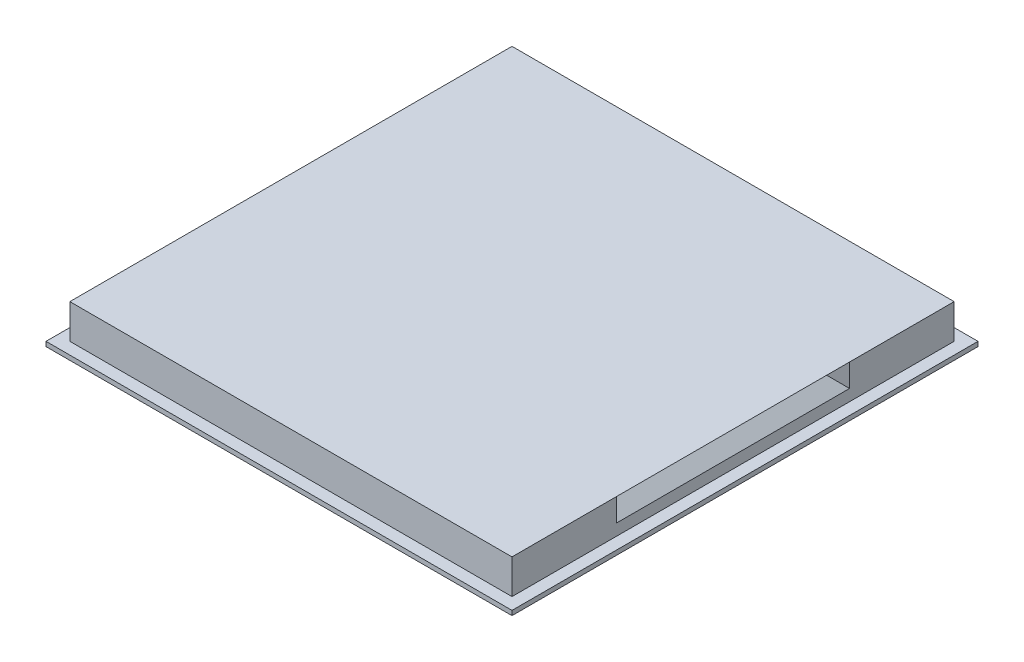
ISO-10303-21;
HEADER;
FILE_DESCRIPTION(('STEP AP214'),'2;1');
FILE_NAME('part.step','',(''),(''),'','','');
FILE_SCHEMA(('AUTOMOTIVE_DESIGN { 1 0 10303 214 1 1 1 1 }'));
ENDSEC;
DATA;
#1=APPLICATION_CONTEXT('core data for automotive mechanical design processes');
#2=APPLICATION_PROTOCOL_DEFINITION('international standard','automotive_design',2000,#1);
#3=PRODUCT_CONTEXT('',#1,'mechanical');
#4=PRODUCT('Part','Part','',(#3));
#5=PRODUCT_RELATED_PRODUCT_CATEGORY('part','',(#4));
#6=PRODUCT_DEFINITION_FORMATION('','',#4);
#7=PRODUCT_DEFINITION_CONTEXT('part definition',#1,'design');
#8=PRODUCT_DEFINITION('design','',#6,#7);
#9=PRODUCT_DEFINITION_SHAPE('','',#8);
#10=(LENGTH_UNIT() NAMED_UNIT(*) SI_UNIT(.MILLI.,.METRE.));
#11=(NAMED_UNIT(*) PLANE_ANGLE_UNIT() SI_UNIT($,.RADIAN.));
#12=(NAMED_UNIT(*) SI_UNIT($,.STERADIAN.) SOLID_ANGLE_UNIT());
#13=UNCERTAINTY_MEASURE_WITH_UNIT(LENGTH_MEASURE(1.E-05),#10,'distance_accuracy_value','');
#14=(GEOMETRIC_REPRESENTATION_CONTEXT(3) GLOBAL_UNCERTAINTY_ASSIGNED_CONTEXT((#13)) GLOBAL_UNIT_ASSIGNED_CONTEXT((#10,
#11,#12)) REPRESENTATION_CONTEXT('',''));
#15=CARTESIAN_POINT('',(0.,0.,0.));
#16=DIRECTION('',(0.,0.,1.));
#17=DIRECTION('',(1.,0.,0.));
#18=AXIS2_PLACEMENT_3D('',#15,#16,#17);
#19=CARTESIAN_POINT('',(88.9061151079137,17.,-53.0476618705036));
#20=DIRECTION('',(-1.,0.,0.));
#21=DIRECTION('',(0.,0.,1.));
#22=AXIS2_PLACEMENT_3D('',#19,#20,#21);
#23=PLANE('',#22);
#24=DIRECTION('',(0.,-1.,0.));
#25=VECTOR('',#24,1.);
#26=CARTESIAN_POINT('',(88.9061151079137,17.,-7.44766187050363));
#27=LINE('',#26,#25);
#28=CARTESIAN_POINT('',(88.9061151079137,17.,-7.44766187050363));
#29=VERTEX_POINT('',#28);
#30=CARTESIAN_POINT('',(88.9061151079137,6.99999999999995,-7.44766187050363));
#31=VERTEX_POINT('',#30);
#32=EDGE_CURVE('E58',#29,#31,#27,.T.);
#33=ORIENTED_EDGE('',*,*,#32,.T.);
#34=DIRECTION('',(0.,0.,1.));
#35=VECTOR('',#34,1.);
#36=CARTESIAN_POINT('',(88.9061151079137,6.99999999999995,-7.44766187050363));
#37=LINE('',#36,#35);
#38=CARTESIAN_POINT('',(88.9061151079137,6.99999999999999,94.1523381294964));
#39=VERTEX_POINT('',#38);
#40=EDGE_CURVE('E169',#31,#39,#37,.T.);
#41=ORIENTED_EDGE('',*,*,#40,.T.);
#42=DIRECTION('',(0.,1.,0.));
#43=VECTOR('',#42,1.);
#44=CARTESIAN_POINT('',(88.9061151079137,17.,94.1523381294964));
#45=LINE('',#44,#43);
#46=CARTESIAN_POINT('',(88.9061151079137,17.,94.1523381294964));
#47=VERTEX_POINT('',#46);
#48=EDGE_CURVE('E152',#39,#47,#45,.T.);
#49=ORIENTED_EDGE('',*,*,#48,.T.);
#50=DIRECTION('',(0.,0.,-1.));
#51=VECTOR('',#50,1.);
#52=CARTESIAN_POINT('',(88.9061151079137,17.,-53.0476618705036));
#53=LINE('',#52,#51);
#54=CARTESIAN_POINT('',(88.9061151079137,17.,139.752338129496));
#55=VERTEX_POINT('',#54);
#56=EDGE_CURVE('E168',#55,#47,#53,.T.);
#57=ORIENTED_EDGE('',*,*,#56,.F.);
#58=DIRECTION('',(0.,-1.,0.));
#59=VECTOR('',#58,1.);
#60=CARTESIAN_POINT('',(88.9061151079137,17.,139.752338129496));
#61=LINE('',#60,#59);
#62=CARTESIAN_POINT('',(88.9061151079137,2.,139.752338129496));
#63=VERTEX_POINT('',#62);
#64=EDGE_CURVE('E203',#55,#63,#61,.T.);
#65=ORIENTED_EDGE('',*,*,#64,.T.);
#66=DIRECTION('',(0.,0.,-1.));
#67=VECTOR('',#66,1.);
#68=CARTESIAN_POINT('',(88.9061151079137,2.,-53.0476618705036));
#69=LINE('',#68,#67);
#70=CARTESIAN_POINT('',(88.9061151079137,2.,-53.0476618705036));
#71=VERTEX_POINT('',#70);
#72=EDGE_CURVE('E191',#63,#71,#69,.T.);
#73=ORIENTED_EDGE('',*,*,#72,.T.);
#74=DIRECTION('',(0.,-1.,0.));
#75=VECTOR('',#74,1.);
#76=CARTESIAN_POINT('',(88.9061151079137,17.,-53.0476618705036));
#77=LINE('',#76,#75);
#78=CARTESIAN_POINT('',(88.9061151079137,17.,-53.0476618705036));
#79=VERTEX_POINT('',#78);
#80=EDGE_CURVE('E200',#79,#71,#77,.T.);
#81=ORIENTED_EDGE('',*,*,#80,.F.);
#82=EDGE_CURVE('E177',#29,#79,#53,.T.);
#83=ORIENTED_EDGE('',*,*,#82,.F.);
#84=EDGE_LOOP('',(#33,#41,#49,#57,#65,#73,#81,#83));
#85=FACE_BOUND('',#84,.T.);
#86=ADVANCED_FACE('F43',(#85),#23,.F.);
#87=CARTESIAN_POINT('',(-109.093884892086,2.,-58.2476618705036));
#88=DIRECTION('',(1.,0.,0.));
#89=DIRECTION('',(0.,0.,-1.));
#90=AXIS2_PLACEMENT_3D('',#87,#88,#89);
#91=PLANE('',#90);
#92=DIRECTION('',(0.,0.,1.));
#93=VECTOR('',#92,1.);
#94=CARTESIAN_POINT('',(-109.093884892086,0.,-58.2476618705036));
#95=LINE('',#94,#93);
#96=CARTESIAN_POINT('',(-109.093884892086,0.,-58.2476618705036));
#97=VERTEX_POINT('',#96);
#98=CARTESIAN_POINT('',(-109.093884892086,0.,144.952338129496));
#99=VERTEX_POINT('',#98);
#100=EDGE_CURVE('E208',#97,#99,#95,.T.);
#101=ORIENTED_EDGE('',*,*,#100,.T.);
#102=DIRECTION('',(0.,-1.,0.));
#103=VECTOR('',#102,1.);
#104=CARTESIAN_POINT('',(-109.093884892086,2.,144.952338129496));
#105=LINE('',#104,#103);
#106=CARTESIAN_POINT('',(-109.093884892086,2.,144.952338129496));
#107=VERTEX_POINT('',#106);
#108=EDGE_CURVE('E11',#107,#99,#105,.T.);
#109=ORIENTED_EDGE('',*,*,#108,.F.);
#110=DIRECTION('',(0.,0.,1.));
#111=VECTOR('',#110,1.);
#112=CARTESIAN_POINT('',(-109.093884892086,2.,-58.2476618705036));
#113=LINE('',#112,#111);
#114=CARTESIAN_POINT('',(-109.093884892086,2.,-58.2476618705036));
#115=VERTEX_POINT('',#114);
#116=EDGE_CURVE('E209',#115,#107,#113,.T.);
#117=ORIENTED_EDGE('',*,*,#116,.F.);
#118=DIRECTION('',(0.,-1.,0.));
#119=VECTOR('',#118,1.);
#120=CARTESIAN_POINT('',(-109.093884892086,2.,-58.2476618705036));
#121=LINE('',#120,#119);
#122=EDGE_CURVE('E219',#115,#97,#121,.T.);
#123=ORIENTED_EDGE('',*,*,#122,.T.);
#124=EDGE_LOOP('',(#101,#109,#117,#123));
#125=FACE_BOUND('',#124,.T.);
#126=ADVANCED_FACE('F45',(#125),#91,.F.);
#127=CARTESIAN_POINT('',(-109.093884892086,2.,144.952338129496));
#128=DIRECTION('',(0.,0.,-1.));
#129=DIRECTION('',(-1.,0.,0.));
#130=AXIS2_PLACEMENT_3D('',#127,#128,#129);
#131=PLANE('',#130);
#132=DIRECTION('',(1.,0.,0.));
#133=VECTOR('',#132,1.);
#134=CARTESIAN_POINT('',(-109.093884892086,0.,144.952338129496));
#135=LINE('',#134,#133);
#136=CARTESIAN_POINT('',(94.1061151079136,0.,144.952338129496));
#137=VERTEX_POINT('',#136);
#138=EDGE_CURVE('E222',#99,#137,#135,.T.);
#139=ORIENTED_EDGE('',*,*,#138,.T.);
#140=DIRECTION('',(0.,-1.,0.));
#141=VECTOR('',#140,1.);
#142=CARTESIAN_POINT('',(94.1061151079136,2.,144.952338129496));
#143=LINE('',#142,#141);
#144=CARTESIAN_POINT('',(94.1061151079136,2.,144.952338129496));
#145=VERTEX_POINT('',#144);
#146=EDGE_CURVE('E51',#145,#137,#143,.T.);
#147=ORIENTED_EDGE('',*,*,#146,.F.);
#148=DIRECTION('',(1.,0.,0.));
#149=VECTOR('',#148,1.);
#150=CARTESIAN_POINT('',(-109.093884892086,2.,144.952338129496));
#151=LINE('',#150,#149);
#152=EDGE_CURVE('E212',#107,#145,#151,.T.);
#153=ORIENTED_EDGE('',*,*,#152,.F.);
#154=ORIENTED_EDGE('',*,*,#108,.T.);
#155=EDGE_LOOP('',(#139,#147,#153,#154));
#156=FACE_BOUND('',#155,.T.);
#157=ADVANCED_FACE('F252',(#156),#131,.F.);
#158=CARTESIAN_POINT('',(94.1061151079136,2.,-58.2476618705036));
#159=DIRECTION('',(-1.,0.,0.));
#160=DIRECTION('',(0.,0.,1.));
#161=AXIS2_PLACEMENT_3D('',#158,#159,#160);
#162=PLANE('',#161);
#163=DIRECTION('',(0.,0.,-1.));
#164=VECTOR('',#163,1.);
#165=CARTESIAN_POINT('',(94.1061151079136,0.,-58.2476618705036));
#166=LINE('',#165,#164);
#167=CARTESIAN_POINT('',(94.1061151079136,0.,-58.2476618705036));
#168=VERTEX_POINT('',#167);
#169=EDGE_CURVE('E224',#137,#168,#166,.T.);
#170=ORIENTED_EDGE('',*,*,#169,.T.);
#171=DIRECTION('',(0.,-1.,0.));
#172=VECTOR('',#171,1.);
#173=CARTESIAN_POINT('',(94.1061151079136,2.,-58.2476618705036));
#174=LINE('',#173,#172);
#175=CARTESIAN_POINT('',(94.1061151079136,2.,-58.2476618705036));
#176=VERTEX_POINT('',#175);
#177=EDGE_CURVE('E229',#176,#168,#174,.T.);
#178=ORIENTED_EDGE('',*,*,#177,.F.);
#179=DIRECTION('',(0.,0.,-1.));
#180=VECTOR('',#179,1.);
#181=CARTESIAN_POINT('',(94.1061151079136,2.,-58.2476618705036));
#182=LINE('',#181,#180);
#183=EDGE_CURVE('E215',#145,#176,#182,.T.);
#184=ORIENTED_EDGE('',*,*,#183,.F.);
#185=ORIENTED_EDGE('',*,*,#146,.T.);
#186=EDGE_LOOP('',(#170,#178,#184,#185));
#187=FACE_BOUND('',#186,.T.);
#188=ADVANCED_FACE('F236',(#187),#162,.F.);
#189=CARTESIAN_POINT('',(-109.093884892086,2.,-58.2476618705036));
#190=DIRECTION('',(0.,0.,1.));
#191=DIRECTION('',(1.,0.,0.));
#192=AXIS2_PLACEMENT_3D('',#189,#190,#191);
#193=PLANE('',#192);
#194=DIRECTION('',(-1.,0.,0.));
#195=VECTOR('',#194,1.);
#196=CARTESIAN_POINT('',(-109.093884892086,0.,-58.2476618705036));
#197=LINE('',#196,#195);
#198=EDGE_CURVE('E213',#168,#97,#197,.T.);
#199=ORIENTED_EDGE('',*,*,#198,.T.);
#200=ORIENTED_EDGE('',*,*,#122,.F.);
#201=DIRECTION('',(-1.,0.,0.));
#202=VECTOR('',#201,1.);
#203=CARTESIAN_POINT('',(-109.093884892086,2.,-58.2476618705036));
#204=LINE('',#203,#202);
#205=EDGE_CURVE('E217',#176,#115,#204,.T.);
#206=ORIENTED_EDGE('',*,*,#205,.F.);
#207=ORIENTED_EDGE('',*,*,#177,.T.);
#208=EDGE_LOOP('',(#199,#200,#206,#207));
#209=FACE_BOUND('',#208,.T.);
#210=ADVANCED_FACE('F245',(#209),#193,.F.);
#211=CARTESIAN_POINT('',(0.,2.,0.));
#212=DIRECTION('',(0.,1.,0.));
#213=DIRECTION('',(0.,0.,1.));
#214=AXIS2_PLACEMENT_3D('',#211,#212,#213);
#215=PLANE('',#214);
#216=DIRECTION('',(0.,0.,1.));
#217=VECTOR('',#216,1.);
#218=CARTESIAN_POINT('',(-103.893884892086,2.,-53.0476618705036));
#219=LINE('',#218,#217);
#220=CARTESIAN_POINT('',(-103.893884892086,2.,-53.0476618705036));
#221=VERTEX_POINT('',#220);
#222=CARTESIAN_POINT('',(-103.893884892086,2.,139.752338129496));
#223=VERTEX_POINT('',#222);
#224=EDGE_CURVE('E184',#221,#223,#219,.T.);
#225=ORIENTED_EDGE('',*,*,#224,.F.);
#226=DIRECTION('',(-1.,0.,0.));
#227=VECTOR('',#226,1.);
#228=CARTESIAN_POINT('',(-103.893884892086,2.,-53.0476618705036));
#229=LINE('',#228,#227);
#230=EDGE_CURVE('E194',#71,#221,#229,.T.);
#231=ORIENTED_EDGE('',*,*,#230,.F.);
#232=ORIENTED_EDGE('',*,*,#72,.F.);
#233=DIRECTION('',(1.,0.,0.));
#234=VECTOR('',#233,1.);
#235=CARTESIAN_POINT('',(-103.893884892086,2.,139.752338129496));
#236=LINE('',#235,#234);
#237=EDGE_CURVE('E187',#223,#63,#236,.T.);
#238=ORIENTED_EDGE('',*,*,#237,.F.);
#239=EDGE_LOOP('',(#225,#231,#232,#238));
#240=FACE_BOUND('',#239,.T.);
#241=ORIENTED_EDGE('',*,*,#116,.T.);
#242=ORIENTED_EDGE('',*,*,#152,.T.);
#243=ORIENTED_EDGE('',*,*,#183,.T.);
#244=ORIENTED_EDGE('',*,*,#205,.T.);
#245=EDGE_LOOP('',(#241,#242,#243,#244));
#246=FACE_BOUND('',#245,.T.);
#247=ADVANCED_FACE('F251',(#240,#246),#215,.T.);
#248=CARTESIAN_POINT('',(0.,0.,0.));
#249=DIRECTION('',(0.,1.,0.));
#250=DIRECTION('',(0.,0.,1.));
#251=AXIS2_PLACEMENT_3D('',#248,#249,#250);
#252=PLANE('',#251);
#253=ORIENTED_EDGE('',*,*,#100,.F.);
#254=ORIENTED_EDGE('',*,*,#198,.F.);
#255=ORIENTED_EDGE('',*,*,#169,.F.);
#256=ORIENTED_EDGE('',*,*,#138,.F.);
#257=EDGE_LOOP('',(#253,#254,#255,#256));
#258=FACE_BOUND('',#257,.T.);
#259=ADVANCED_FACE('F242',(#258),#252,.F.);
#260=CARTESIAN_POINT('',(-103.893884892086,17.,-53.0476618705036));
#261=DIRECTION('',(1.,0.,0.));
#262=DIRECTION('',(0.,0.,-1.));
#263=AXIS2_PLACEMENT_3D('',#260,#261,#262);
#264=PLANE('',#263);
#265=DIRECTION('',(0.,0.,1.));
#266=VECTOR('',#265,1.);
#267=CARTESIAN_POINT('',(-103.893884892086,6.99999999999995,-7.4476618705036));
#268=LINE('',#267,#266);
#269=CARTESIAN_POINT('',(-103.893884892086,6.99999999999995,-7.4476618705036));
#270=VERTEX_POINT('',#269);
#271=CARTESIAN_POINT('',(-103.893884892086,6.99999999999999,94.1523381294964));
#272=VERTEX_POINT('',#271);
#273=EDGE_CURVE('E431',#270,#272,#268,.T.);
#274=ORIENTED_EDGE('',*,*,#273,.F.);
#275=DIRECTION('',(0.,-1.,0.));
#276=VECTOR('',#275,1.);
#277=CARTESIAN_POINT('',(-103.893884892086,17.,-7.4476618705036));
#278=LINE('',#277,#276);
#279=CARTESIAN_POINT('',(-103.893884892086,17.,-7.4476618705036));
#280=VERTEX_POINT('',#279);
#281=EDGE_CURVE('E428',#280,#270,#278,.T.);
#282=ORIENTED_EDGE('',*,*,#281,.F.);
#283=DIRECTION('',(0.,0.,1.));
#284=VECTOR('',#283,1.);
#285=CARTESIAN_POINT('',(-103.893884892086,17.,-53.0476618705036));
#286=LINE('',#285,#284);
#287=CARTESIAN_POINT('',(-103.893884892086,17.,-53.0476618705036));
#288=VERTEX_POINT('',#287);
#289=EDGE_CURVE('E446',#288,#280,#286,.T.);
#290=ORIENTED_EDGE('',*,*,#289,.F.);
#291=DIRECTION('',(0.,-1.,0.));
#292=VECTOR('',#291,1.);
#293=CARTESIAN_POINT('',(-103.893884892086,17.,-53.0476618705036));
#294=LINE('',#293,#292);
#295=EDGE_CURVE('E179',#288,#221,#294,.T.);
#296=ORIENTED_EDGE('',*,*,#295,.T.);
#297=ORIENTED_EDGE('',*,*,#224,.T.);
#298=DIRECTION('',(0.,-1.,0.));
#299=VECTOR('',#298,1.);
#300=CARTESIAN_POINT('',(-103.893884892086,17.,139.752338129496));
#301=LINE('',#300,#299);
#302=CARTESIAN_POINT('',(-103.893884892086,17.,139.752338129496));
#303=VERTEX_POINT('',#302);
#304=EDGE_CURVE('E205',#303,#223,#301,.T.);
#305=ORIENTED_EDGE('',*,*,#304,.F.);
#306=CARTESIAN_POINT('',(-103.893884892086,17.,94.1523381294964));
#307=VERTEX_POINT('',#306);
#308=EDGE_CURVE('E197',#307,#303,#286,.T.);
#309=ORIENTED_EDGE('',*,*,#308,.F.);
#310=DIRECTION('',(0.,1.,0.));
#311=VECTOR('',#310,1.);
#312=CARTESIAN_POINT('',(-103.893884892086,17.,94.1523381294964));
#313=LINE('',#312,#311);
#314=EDGE_CURVE('E66',#272,#307,#313,.T.);
#315=ORIENTED_EDGE('',*,*,#314,.F.);
#316=EDGE_LOOP('',(#274,#282,#290,#296,#297,#305,#309,#315));
#317=FACE_BOUND('',#316,.T.);
#318=ADVANCED_FACE('F272',(#317),#264,.F.);
#319=CARTESIAN_POINT('',(-103.893884892086,17.,139.752338129496));
#320=DIRECTION('',(0.,0.,-1.));
#321=DIRECTION('',(-1.,0.,0.));
#322=AXIS2_PLACEMENT_3D('',#319,#320,#321);
#323=PLANE('',#322);
#324=ORIENTED_EDGE('',*,*,#237,.T.);
#325=ORIENTED_EDGE('',*,*,#64,.F.);
#326=DIRECTION('',(1.,0.,0.));
#327=VECTOR('',#326,1.);
#328=CARTESIAN_POINT('',(-103.893884892086,17.,139.752338129496));
#329=LINE('',#328,#327);
#330=EDGE_CURVE('E174',#303,#55,#329,.T.);
#331=ORIENTED_EDGE('',*,*,#330,.F.);
#332=ORIENTED_EDGE('',*,*,#304,.T.);
#333=EDGE_LOOP('',(#324,#325,#331,#332));
#334=FACE_BOUND('',#333,.T.);
#335=ADVANCED_FACE('F269',(#334),#323,.F.);
#336=CARTESIAN_POINT('',(-103.893884892086,17.,-53.0476618705036));
#337=DIRECTION('',(0.,0.,1.));
#338=DIRECTION('',(1.,0.,0.));
#339=AXIS2_PLACEMENT_3D('',#336,#337,#338);
#340=PLANE('',#339);
#341=ORIENTED_EDGE('',*,*,#230,.T.);
#342=ORIENTED_EDGE('',*,*,#295,.F.);
#343=DIRECTION('',(-1.,0.,0.));
#344=VECTOR('',#343,1.);
#345=CARTESIAN_POINT('',(-103.893884892086,17.,-53.0476618705036));
#346=LINE('',#345,#344);
#347=EDGE_CURVE('E176',#79,#288,#346,.T.);
#348=ORIENTED_EDGE('',*,*,#347,.F.);
#349=ORIENTED_EDGE('',*,*,#80,.T.);
#350=EDGE_LOOP('',(#341,#342,#348,#349));
#351=FACE_BOUND('',#350,.T.);
#352=ADVANCED_FACE('F267',(#351),#340,.F.);
#353=CARTESIAN_POINT('',(0.,17.,0.));
#354=DIRECTION('',(0.,1.,0.));
#355=DIRECTION('',(0.,0.,1.));
#356=AXIS2_PLACEMENT_3D('',#353,#354,#355);
#357=PLANE('',#356);
#358=ORIENTED_EDGE('',*,*,#289,.T.);
#359=DIRECTION('',(0.,0.,-1.));
#360=VECTOR('',#359,1.);
#361=CARTESIAN_POINT('',(-103.893884892086,17.,-7.4476618705036));
#362=LINE('',#361,#360);
#363=EDGE_CURVE('E435',#307,#280,#362,.T.);
#364=ORIENTED_EDGE('',*,*,#363,.F.);
#365=ORIENTED_EDGE('',*,*,#308,.T.);
#366=ORIENTED_EDGE('',*,*,#330,.T.);
#367=ORIENTED_EDGE('',*,*,#56,.T.);
#368=DIRECTION('',(0.,0.,-1.));
#369=VECTOR('',#368,1.);
#370=CARTESIAN_POINT('',(88.9061151079137,17.,-7.44766187050363));
#371=LINE('',#370,#369);
#372=EDGE_CURVE('E159',#47,#29,#371,.T.);
#373=ORIENTED_EDGE('',*,*,#372,.T.);
#374=ORIENTED_EDGE('',*,*,#82,.T.);
#375=ORIENTED_EDGE('',*,*,#347,.T.);
#376=EDGE_LOOP('',(#358,#364,#365,#366,#367,#373,#374,#375));
#377=FACE_BOUND('',#376,.T.);
#378=ADVANCED_FACE('F172',(#377),#357,.T.);
#379=CARTESIAN_POINT('',(-103.893884892086,17.,-7.4476618705036));
#380=DIRECTION('',(0.707106781186549,0.,-0.707106781186546));
#381=DIRECTION('',(-0.707106781186546,0.,-0.707106781186549));
#382=AXIS2_PLACEMENT_3D('',#379,#380,#381);
#383=PLANE('',#382);
#384=ORIENTED_EDGE('',*,*,#281,.T.);
#385=DIRECTION('',(-0.577350269189625,-0.577350269189627,-0.577350269189626));
#386=VECTOR('',#385,1.);
#387=CARTESIAN_POINT('',(-100.560551558753,10.3333333333333,-4.11432853717026));
#388=LINE('',#387,#386);
#389=CARTESIAN_POINT('',(-98.8938848920864,12.,-2.4476618705036));
#390=VERTEX_POINT('',#389);
#391=EDGE_CURVE('E438',#390,#270,#388,.T.);
#392=ORIENTED_EDGE('',*,*,#391,.F.);
#393=DIRECTION('',(-0.577350269189625,0.577350269189626,-0.577350269189627));
#394=VECTOR('',#393,1.);
#395=CARTESIAN_POINT('',(-103.893884892086,17.,-7.4476618705036));
#396=LINE('',#395,#394);
#397=EDGE_CURVE('E439',#390,#280,#396,.T.);
#398=ORIENTED_EDGE('',*,*,#397,.T.);
#399=EDGE_LOOP('',(#384,#392,#398));
#400=FACE_BOUND('',#399,.T.);
#401=ADVANCED_FACE('F319',(#400),#383,.F.);
#402=CARTESIAN_POINT('',(-103.893884892086,17.,-7.4476618705036));
#403=DIRECTION('',(0.707106781186549,0.707106781186546,0.));
#404=DIRECTION('',(-0.707106781186546,0.707106781186549,0.));
#405=AXIS2_PLACEMENT_3D('',#402,#403,#404);
#406=PLANE('',#405);
#407=DIRECTION('',(-0.577350269189624,0.577350269189627,0.577350269189627));
#408=VECTOR('',#407,1.);
#409=CARTESIAN_POINT('',(-103.893884892086,17.,94.1523381294964));
#410=LINE('',#409,#408);
#411=CARTESIAN_POINT('',(-98.8938848920864,12.,89.1523381294964));
#412=VERTEX_POINT('',#411);
#413=EDGE_CURVE('E441',#412,#307,#410,.T.);
#414=ORIENTED_EDGE('',*,*,#413,.T.);
#415=ORIENTED_EDGE('',*,*,#363,.T.);
#416=ORIENTED_EDGE('',*,*,#397,.F.);
#417=DIRECTION('',(0.,0.,-1.));
#418=VECTOR('',#417,1.);
#419=CARTESIAN_POINT('',(-98.8938848920864,12.,-7.4476618705036));
#420=LINE('',#419,#418);
#421=EDGE_CURVE('E188',#412,#390,#420,.T.);
#422=ORIENTED_EDGE('',*,*,#421,.F.);
#423=EDGE_LOOP('',(#414,#415,#416,#422));
#424=FACE_BOUND('',#423,.T.);
#425=ADVANCED_FACE('F323',(#424),#406,.F.);
#426=CARTESIAN_POINT('',(-103.893884892086,17.,94.1523381294964));
#427=DIRECTION('',(0.707106781186549,0.,0.707106781186546));
#428=DIRECTION('',(0.707106781186546,0.,-0.707106781186549));
#429=AXIS2_PLACEMENT_3D('',#426,#427,#428);
#430=PLANE('',#429);
#431=ORIENTED_EDGE('',*,*,#314,.T.);
#432=ORIENTED_EDGE('',*,*,#413,.F.);
#433=DIRECTION('',(-0.577350269189624,-0.577350269189626,0.577350269189627));
#434=VECTOR('',#433,1.);
#435=CARTESIAN_POINT('',(-70.0272182254197,40.8666666666667,60.2856714628296));
#436=LINE('',#435,#434);
#437=EDGE_CURVE('E443',#412,#272,#436,.T.);
#438=ORIENTED_EDGE('',*,*,#437,.T.);
#439=EDGE_LOOP('',(#431,#432,#438));
#440=FACE_BOUND('',#439,.T.);
#441=ADVANCED_FACE('F332',(#440),#430,.F.);
#442=CARTESIAN_POINT('',(-103.893884892086,6.99999999999995,-7.4476618705036));
#443=DIRECTION('',(0.707106781186549,-0.707106781186546,0.));
#444=DIRECTION('',(0.707106781186546,0.707106781186549,0.));
#445=AXIS2_PLACEMENT_3D('',#442,#443,#444);
#446=PLANE('',#445);
#447=ORIENTED_EDGE('',*,*,#421,.T.);
#448=ORIENTED_EDGE('',*,*,#391,.T.);
#449=ORIENTED_EDGE('',*,*,#273,.T.);
#450=ORIENTED_EDGE('',*,*,#437,.F.);
#451=EDGE_LOOP('',(#447,#448,#449,#450));
#452=FACE_BOUND('',#451,.T.);
#453=ADVANCED_FACE('F340',(#452),#446,.F.);
#454=CARTESIAN_POINT('',(88.9061151079137,17.,-7.44766187050363));
#455=DIRECTION('',(-0.707106781186549,0.,-0.707106781186546));
#456=DIRECTION('',(-0.707106781186546,0.,0.707106781186549));
#457=AXIS2_PLACEMENT_3D('',#454,#455,#456);
#458=PLANE('',#457);
#459=ORIENTED_EDGE('',*,*,#32,.F.);
#460=DIRECTION('',(0.577350269189624,0.577350269189626,-0.577350269189627));
#461=VECTOR('',#460,1.);
#462=CARTESIAN_POINT('',(88.9061151079137,17.,-7.44766187050363));
#463=LINE('',#462,#461);
#464=CARTESIAN_POINT('',(83.9061151079137,12.,-2.44766187050362));
#465=VERTEX_POINT('',#464);
#466=EDGE_CURVE('E156',#465,#29,#463,.T.);
#467=ORIENTED_EDGE('',*,*,#466,.F.);
#468=DIRECTION('',(0.577350269189624,-0.577350269189627,-0.577350269189626));
#469=VECTOR('',#468,1.);
#470=CARTESIAN_POINT('',(88.9061151079137,6.99999999999995,-7.44766187050363));
#471=LINE('',#470,#469);
#472=EDGE_CURVE('E422',#465,#31,#471,.T.);
#473=ORIENTED_EDGE('',*,*,#472,.T.);
#474=EDGE_LOOP('',(#459,#467,#473));
#475=FACE_BOUND('',#474,.T.);
#476=ADVANCED_FACE('F347',(#475),#458,.F.);
#477=CARTESIAN_POINT('',(88.9061151079137,6.99999999999995,-7.44766187050363));
#478=DIRECTION('',(-0.707106781186549,-0.707106781186546,0.));
#479=DIRECTION('',(0.707106781186546,-0.707106781186549,0.));
#480=AXIS2_PLACEMENT_3D('',#477,#478,#479);
#481=PLANE('',#480);
#482=DIRECTION('',(0.577350269189625,-0.577350269189626,0.577350269189626));
#483=VECTOR('',#482,1.);
#484=CARTESIAN_POINT('',(85.5727817745804,10.3333333333333,90.819004796163));
#485=LINE('',#484,#483);
#486=CARTESIAN_POINT('',(83.9061151079138,12.,89.1523381294964));
#487=VERTEX_POINT('',#486);
#488=EDGE_CURVE('E154',#487,#39,#485,.T.);
#489=ORIENTED_EDGE('',*,*,#488,.T.);
#490=ORIENTED_EDGE('',*,*,#40,.F.);
#491=ORIENTED_EDGE('',*,*,#472,.F.);
#492=DIRECTION('',(0.,0.,-1.));
#493=VECTOR('',#492,1.);
#494=CARTESIAN_POINT('',(83.9061151079137,12.,-7.44766187050363));
#495=LINE('',#494,#493);
#496=EDGE_CURVE('E421',#487,#465,#495,.T.);
#497=ORIENTED_EDGE('',*,*,#496,.F.);
#498=EDGE_LOOP('',(#489,#490,#491,#497));
#499=FACE_BOUND('',#498,.T.);
#500=ADVANCED_FACE('F364',(#499),#481,.F.);
#501=CARTESIAN_POINT('',(88.9061151079137,17.,94.1523381294964));
#502=DIRECTION('',(-0.707106781186549,0.,0.707106781186546));
#503=DIRECTION('',(0.707106781186546,0.,0.707106781186549));
#504=AXIS2_PLACEMENT_3D('',#501,#502,#503);
#505=PLANE('',#504);
#506=ORIENTED_EDGE('',*,*,#48,.F.);
#507=ORIENTED_EDGE('',*,*,#488,.F.);
#508=DIRECTION('',(0.577350269189624,0.577350269189627,0.577350269189626));
#509=VECTOR('',#508,1.);
#510=CARTESIAN_POINT('',(55.0394484412471,-16.8666666666668,60.2856714628296));
#511=LINE('',#510,#509);
#512=EDGE_CURVE('E148',#487,#47,#511,.T.);
#513=ORIENTED_EDGE('',*,*,#512,.T.);
#514=EDGE_LOOP('',(#506,#507,#513));
#515=FACE_BOUND('',#514,.T.);
#516=ADVANCED_FACE('F150',(#515),#505,.F.);
#517=CARTESIAN_POINT('',(88.9061151079137,17.,-7.44766187050363));
#518=DIRECTION('',(-0.707106781186549,0.707106781186546,0.));
#519=DIRECTION('',(-0.707106781186546,-0.707106781186549,0.));
#520=AXIS2_PLACEMENT_3D('',#517,#518,#519);
#521=PLANE('',#520);
#522=ORIENTED_EDGE('',*,*,#496,.T.);
#523=ORIENTED_EDGE('',*,*,#466,.T.);
#524=ORIENTED_EDGE('',*,*,#372,.F.);
#525=ORIENTED_EDGE('',*,*,#512,.F.);
#526=EDGE_LOOP('',(#522,#523,#524,#525));
#527=FACE_BOUND('',#526,.T.);
#528=ADVANCED_FACE('F160',(#527),#521,.F.);
#529=CLOSED_SHELL('',(#86,#126,#157,#188,#210,#247,#259,#318,#335,#352,#378,#401,#425,#441,#453,
#476,#500,#516,#528));
#530=MANIFOLD_SOLID_BREP('B2',#529);
#531=ADVANCED_BREP_SHAPE_REPRESENTATION('',(#18,#530),#14);
#532=SHAPE_DEFINITION_REPRESENTATION(#9,#531);
ENDSEC;
END-ISO-10303-21;
